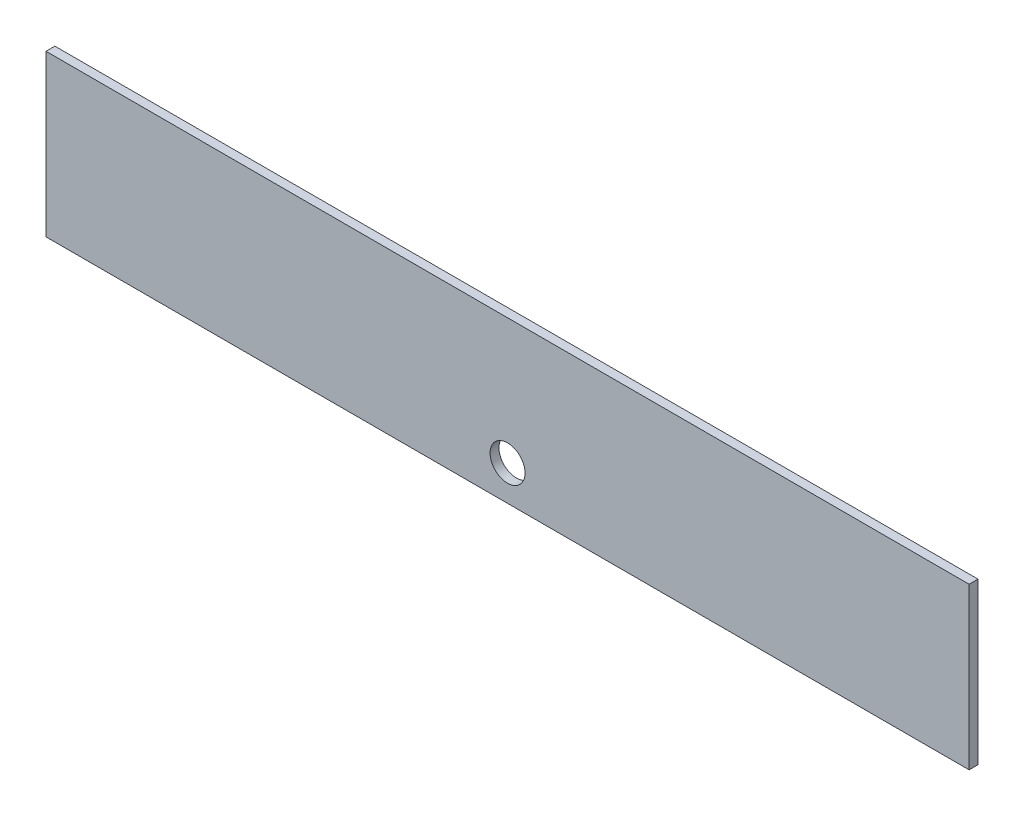
ISO-10303-21;
HEADER;
FILE_DESCRIPTION(('STEP AP214'),'2;1');
FILE_NAME('part.step','',(''),(''),'','','');
FILE_SCHEMA(('AUTOMOTIVE_DESIGN { 1 0 10303 214 1 1 1 1 }'));
ENDSEC;
DATA;
#1=APPLICATION_CONTEXT('core data for automotive mechanical design processes');
#2=APPLICATION_PROTOCOL_DEFINITION('international standard','automotive_design',2000,#1);
#3=PRODUCT_CONTEXT('',#1,'mechanical');
#4=PRODUCT('Part','Part','',(#3));
#5=PRODUCT_RELATED_PRODUCT_CATEGORY('part','',(#4));
#6=PRODUCT_DEFINITION_FORMATION('','',#4);
#7=PRODUCT_DEFINITION_CONTEXT('part definition',#1,'design');
#8=PRODUCT_DEFINITION('design','',#6,#7);
#9=PRODUCT_DEFINITION_SHAPE('','',#8);
#10=(LENGTH_UNIT() NAMED_UNIT(*) SI_UNIT(.MILLI.,.METRE.));
#11=(NAMED_UNIT(*) PLANE_ANGLE_UNIT() SI_UNIT($,.RADIAN.));
#12=(NAMED_UNIT(*) SI_UNIT($,.STERADIAN.) SOLID_ANGLE_UNIT());
#13=UNCERTAINTY_MEASURE_WITH_UNIT(LENGTH_MEASURE(1.E-05),#10,'distance_accuracy_value','');
#14=(GEOMETRIC_REPRESENTATION_CONTEXT(3) GLOBAL_UNCERTAINTY_ASSIGNED_CONTEXT((#13)) GLOBAL_UNIT_ASSIGNED_CONTEXT((#10,
#11,#12)) REPRESENTATION_CONTEXT('',''));
#15=CARTESIAN_POINT('',(0.,0.,0.));
#16=DIRECTION('',(0.,0.,1.));
#17=DIRECTION('',(1.,0.,0.));
#18=AXIS2_PLACEMENT_3D('',#15,#16,#17);
#19=CARTESIAN_POINT('',(330.2,-25.,6.35));
#20=DIRECTION('',(-1.,0.,0.));
#21=DIRECTION('',(0.,0.,1.));
#22=AXIS2_PLACEMENT_3D('',#19,#20,#21);
#23=PLANE('',#22);
#24=DIRECTION('',(0.,1.,0.));
#25=VECTOR('',#24,1.);
#26=CARTESIAN_POINT('',(330.2,-25.,0.));
#27=LINE('',#26,#25);
#28=CARTESIAN_POINT('',(330.2,-25.,0.));
#29=VERTEX_POINT('',#28);
#30=CARTESIAN_POINT('',(330.2,90.,0.));
#31=VERTEX_POINT('',#30);
#32=EDGE_CURVE('E101',#29,#31,#27,.T.);
#33=ORIENTED_EDGE('',*,*,#32,.T.);
#34=DIRECTION('',(0.,0.,-1.));
#35=VECTOR('',#34,1.);
#36=CARTESIAN_POINT('',(330.2,90.,6.35));
#37=LINE('',#36,#35);
#38=CARTESIAN_POINT('',(330.2,90.,6.35));
#39=VERTEX_POINT('',#38);
#40=EDGE_CURVE('E11',#39,#31,#37,.T.);
#41=ORIENTED_EDGE('',*,*,#40,.F.);
#42=DIRECTION('',(0.,1.,0.));
#43=VECTOR('',#42,1.);
#44=CARTESIAN_POINT('',(330.2,-25.,6.35));
#45=LINE('',#44,#43);
#46=CARTESIAN_POINT('',(330.2,-25.,6.35));
#47=VERTEX_POINT('',#46);
#48=EDGE_CURVE('E89',#47,#39,#45,.T.);
#49=ORIENTED_EDGE('',*,*,#48,.F.);
#50=DIRECTION('',(0.,0.,-1.));
#51=VECTOR('',#50,1.);
#52=CARTESIAN_POINT('',(330.2,-25.,6.35));
#53=LINE('',#52,#51);
#54=EDGE_CURVE('E97',#47,#29,#53,.T.);
#55=ORIENTED_EDGE('',*,*,#54,.T.);
#56=EDGE_LOOP('',(#33,#41,#49,#55));
#57=FACE_BOUND('',#56,.T.);
#58=ADVANCED_FACE('F38',(#57),#23,.F.);
#59=CARTESIAN_POINT('',(-330.2,90.,6.35));
#60=DIRECTION('',(0.,-1.,0.));
#61=DIRECTION('',(0.,0.,-1.));
#62=AXIS2_PLACEMENT_3D('',#59,#60,#61);
#63=PLANE('',#62);
#64=DIRECTION('',(-1.,0.,0.));
#65=VECTOR('',#64,1.);
#66=CARTESIAN_POINT('',(-330.2,90.,0.));
#67=LINE('',#66,#65);
#68=CARTESIAN_POINT('',(-330.2,90.,0.));
#69=VERTEX_POINT('',#68);
#70=EDGE_CURVE('E93',#31,#69,#67,.T.);
#71=ORIENTED_EDGE('',*,*,#70,.T.);
#72=DIRECTION('',(0.,0.,-1.));
#73=VECTOR('',#72,1.);
#74=CARTESIAN_POINT('',(-330.2,90.,6.35));
#75=LINE('',#74,#73);
#76=CARTESIAN_POINT('',(-330.2,90.,6.35));
#77=VERTEX_POINT('',#76);
#78=EDGE_CURVE('E46',#77,#69,#75,.T.);
#79=ORIENTED_EDGE('',*,*,#78,.F.);
#80=DIRECTION('',(-1.,0.,0.));
#81=VECTOR('',#80,1.);
#82=CARTESIAN_POINT('',(-330.2,90.,6.35));
#83=LINE('',#82,#81);
#84=EDGE_CURVE('E84',#39,#77,#83,.T.);
#85=ORIENTED_EDGE('',*,*,#84,.F.);
#86=ORIENTED_EDGE('',*,*,#40,.T.);
#87=EDGE_LOOP('',(#71,#79,#85,#86));
#88=FACE_BOUND('',#87,.T.);
#89=ADVANCED_FACE('F92',(#88),#63,.F.);
#90=CARTESIAN_POINT('',(-330.2,-25.,6.35));
#91=DIRECTION('',(1.,0.,0.));
#92=DIRECTION('',(0.,0.,-1.));
#93=AXIS2_PLACEMENT_3D('',#90,#91,#92);
#94=PLANE('',#93);
#95=DIRECTION('',(0.,-1.,0.));
#96=VECTOR('',#95,1.);
#97=CARTESIAN_POINT('',(-330.2,-25.,0.));
#98=LINE('',#97,#96);
#99=CARTESIAN_POINT('',(-330.2,-25.,0.));
#100=VERTEX_POINT('',#99);
#101=EDGE_CURVE('E71',#69,#100,#98,.T.);
#102=ORIENTED_EDGE('',*,*,#101,.T.);
#103=DIRECTION('',(0.,0.,-1.));
#104=VECTOR('',#103,1.);
#105=CARTESIAN_POINT('',(-330.2,-25.,6.35));
#106=LINE('',#105,#104);
#107=CARTESIAN_POINT('',(-330.2,-25.,6.35));
#108=VERTEX_POINT('',#107);
#109=EDGE_CURVE('E94',#108,#100,#106,.T.);
#110=ORIENTED_EDGE('',*,*,#109,.F.);
#111=DIRECTION('',(0.,-1.,0.));
#112=VECTOR('',#111,1.);
#113=CARTESIAN_POINT('',(-330.2,-25.,6.35));
#114=LINE('',#113,#112);
#115=EDGE_CURVE('E87',#77,#108,#114,.T.);
#116=ORIENTED_EDGE('',*,*,#115,.F.);
#117=ORIENTED_EDGE('',*,*,#78,.T.);
#118=EDGE_LOOP('',(#102,#110,#116,#117));
#119=FACE_BOUND('',#118,.T.);
#120=ADVANCED_FACE('F95',(#119),#94,.F.);
#121=CARTESIAN_POINT('',(-330.2,-25.,6.35));
#122=DIRECTION('',(0.,1.,0.));
#123=DIRECTION('',(0.,0.,1.));
#124=AXIS2_PLACEMENT_3D('',#121,#122,#123);
#125=PLANE('',#124);
#126=DIRECTION('',(1.,0.,0.));
#127=VECTOR('',#126,1.);
#128=CARTESIAN_POINT('',(-330.2,-25.,0.));
#129=LINE('',#128,#127);
#130=EDGE_CURVE('E77',#100,#29,#129,.T.);
#131=ORIENTED_EDGE('',*,*,#130,.T.);
#132=ORIENTED_EDGE('',*,*,#54,.F.);
#133=DIRECTION('',(1.,0.,0.));
#134=VECTOR('',#133,1.);
#135=CARTESIAN_POINT('',(-330.2,-25.,6.35));
#136=LINE('',#135,#134);
#137=EDGE_CURVE('E54',#108,#47,#136,.T.);
#138=ORIENTED_EDGE('',*,*,#137,.F.);
#139=ORIENTED_EDGE('',*,*,#109,.T.);
#140=EDGE_LOOP('',(#131,#132,#138,#139));
#141=FACE_BOUND('',#140,.T.);
#142=ADVANCED_FACE('F109',(#141),#125,.F.);
#143=CARTESIAN_POINT('',(0.,0.,6.35));
#144=DIRECTION('',(0.,0.,-1.));
#145=DIRECTION('',(-1.,0.,0.));
#146=AXIS2_PLACEMENT_3D('',#143,#144,#145);
#147=PLANE('',#146);
#148=CARTESIAN_POINT('',(0.,0.,6.35));
#149=DIRECTION('',(0.,0.,-1.));
#150=DIRECTION('',(-1.,0.,0.));
#151=AXIS2_PLACEMENT_3D('',#148,#149,#150);
#152=CIRCLE('',#151,12.5);
#153=CARTESIAN_POINT('',(-12.5,0.,6.35));
#154=VERTEX_POINT('',#153);
#155=EDGE_CURVE('E104',#154,#154,#152,.T.);
#156=ORIENTED_EDGE('',*,*,#155,.T.);
#157=EDGE_LOOP('',(#156));
#158=FACE_BOUND('',#157,.T.);
#159=ORIENTED_EDGE('',*,*,#48,.T.);
#160=ORIENTED_EDGE('',*,*,#84,.T.);
#161=ORIENTED_EDGE('',*,*,#115,.T.);
#162=ORIENTED_EDGE('',*,*,#137,.T.);
#163=EDGE_LOOP('',(#159,#160,#161,#162));
#164=FACE_BOUND('',#163,.T.);
#165=ADVANCED_FACE('F85',(#158,#164),#147,.F.);
#166=CARTESIAN_POINT('',(0.,0.,0.));
#167=DIRECTION('',(0.,0.,-1.));
#168=DIRECTION('',(-1.,0.,0.));
#169=AXIS2_PLACEMENT_3D('',#166,#167,#168);
#170=PLANE('',#169);
#171=CARTESIAN_POINT('',(0.,0.,0.));
#172=DIRECTION('',(0.,0.,-1.));
#173=DIRECTION('',(-1.,0.,0.));
#174=AXIS2_PLACEMENT_3D('',#171,#172,#173);
#175=CIRCLE('',#174,12.5);
#176=CARTESIAN_POINT('',(-12.5,0.,0.));
#177=VERTEX_POINT('',#176);
#178=EDGE_CURVE('E115',#177,#177,#175,.T.);
#179=ORIENTED_EDGE('',*,*,#178,.F.);
#180=EDGE_LOOP('',(#179));
#181=FACE_BOUND('',#180,.T.);
#182=ORIENTED_EDGE('',*,*,#32,.F.);
#183=ORIENTED_EDGE('',*,*,#130,.F.);
#184=ORIENTED_EDGE('',*,*,#101,.F.);
#185=ORIENTED_EDGE('',*,*,#70,.F.);
#186=EDGE_LOOP('',(#182,#183,#184,#185));
#187=FACE_BOUND('',#186,.T.);
#188=ADVANCED_FACE('F112',(#181,#187),#170,.T.);
#189=CARTESIAN_POINT('',(0.,0.,6.35));
#190=DIRECTION('',(0.,0.,-1.));
#191=DIRECTION('',(-1.,0.,0.));
#192=AXIS2_PLACEMENT_3D('',#189,#190,#191);
#193=CYLINDRICAL_SURFACE('',#192,12.5);
#194=ORIENTED_EDGE('',*,*,#155,.F.);
#195=EDGE_LOOP('',(#194));
#196=FACE_BOUND('',#195,.T.);
#197=ORIENTED_EDGE('',*,*,#178,.T.);
#198=EDGE_LOOP('',(#197));
#199=FACE_BOUND('',#198,.T.);
#200=ADVANCED_FACE('F122',(#196,#199),#193,.F.);
#201=CLOSED_SHELL('',(#58,#89,#120,#142,#165,#188,#200));
#202=MANIFOLD_SOLID_BREP('B2',#201);
#203=ADVANCED_BREP_SHAPE_REPRESENTATION('',(#18,#202),#14);
#204=SHAPE_DEFINITION_REPRESENTATION(#9,#203);
ENDSEC;
END-ISO-10303-21;
